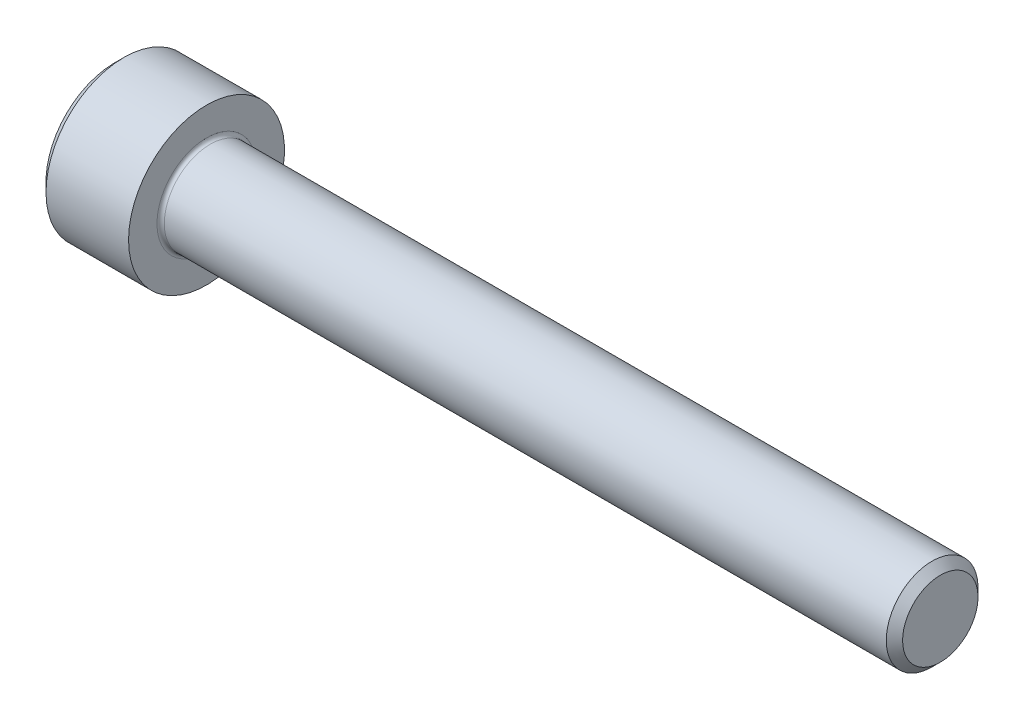
ISO-10303-21;
HEADER;
FILE_DESCRIPTION(('STEP AP214'),'2;1');
FILE_NAME('part.step','',(''),(''),'','','');
FILE_SCHEMA(('AUTOMOTIVE_DESIGN { 1 0 10303 214 1 1 1 1 }'));
ENDSEC;
DATA;
#1=APPLICATION_CONTEXT('core data for automotive mechanical design processes');
#2=APPLICATION_PROTOCOL_DEFINITION('international standard','automotive_design',2000,#1);
#3=PRODUCT_CONTEXT('',#1,'mechanical');
#4=PRODUCT('Part','Part','',(#3));
#5=PRODUCT_RELATED_PRODUCT_CATEGORY('part','',(#4));
#6=PRODUCT_DEFINITION_FORMATION('','',#4);
#7=PRODUCT_DEFINITION_CONTEXT('part definition',#1,'design');
#8=PRODUCT_DEFINITION('design','',#6,#7);
#9=PRODUCT_DEFINITION_SHAPE('','',#8);
#10=(LENGTH_UNIT() NAMED_UNIT(*) SI_UNIT(.MILLI.,.METRE.));
#11=(NAMED_UNIT(*) PLANE_ANGLE_UNIT() SI_UNIT($,.RADIAN.));
#12=(NAMED_UNIT(*) SI_UNIT($,.STERADIAN.) SOLID_ANGLE_UNIT());
#13=UNCERTAINTY_MEASURE_WITH_UNIT(LENGTH_MEASURE(1.E-05),#10,'distance_accuracy_value','');
#14=(GEOMETRIC_REPRESENTATION_CONTEXT(3) GLOBAL_UNCERTAINTY_ASSIGNED_CONTEXT((#13)) GLOBAL_UNIT_ASSIGNED_CONTEXT((#10,
#11,#12)) REPRESENTATION_CONTEXT('',''));
#15=CARTESIAN_POINT('',(0.,0.,0.));
#16=DIRECTION('',(0.,0.,1.));
#17=DIRECTION('',(1.,0.,0.));
#18=AXIS2_PLACEMENT_3D('',#15,#16,#17);
#19=CARTESIAN_POINT('',(2.5,0.,0.));
#20=DIRECTION('',(-1.,0.,0.));
#21=DIRECTION('',(0.,0.,-1.));
#22=AXIS2_PLACEMENT_3D('',#19,#20,#21);
#23=CONICAL_SURFACE('',#22,2.042,1.0471975511966);
#24=DIRECTION('',(-0.5,0.,0.866025403784438));
#25=VECTOR('',#24,1.);
#26=CARTESIAN_POINT('',(2.5,0.,2.042));
#27=LINE('',#26,#25);
#28=CARTESIAN_POINT('',(3.67894924968522,0.,0.));
#29=VERTEX_POINT('',#28);
#30=CARTESIAN_POINT('',(2.5,0.,2.042));
#31=VERTEX_POINT('',#30);
#32=EDGE_CURVE('E11',#29,#31,#27,.T.);
#33=ORIENTED_EDGE('',*,*,#32,.T.);
#34=CARTESIAN_POINT('',(2.5,0.,0.));
#35=DIRECTION('',(1.,0.,0.));
#36=DIRECTION('',(0.,0.,-1.));
#37=AXIS2_PLACEMENT_3D('',#34,#35,#36);
#38=CIRCLE('',#37,2.042);
#39=CARTESIAN_POINT('',(2.5,1.76842387452782,1.021));
#40=VERTEX_POINT('',#39);
#41=EDGE_CURVE('E27',#40,#31,#38,.T.);
#42=ORIENTED_EDGE('',*,*,#41,.F.);
#43=CARTESIAN_POINT('',(2.5,0.,0.));
#44=DIRECTION('',(1.,0.,0.));
#45=DIRECTION('',(0.,0.,-1.));
#46=AXIS2_PLACEMENT_3D('',#43,#44,#45);
#47=CIRCLE('',#46,2.042);
#48=CARTESIAN_POINT('',(2.5,1.76842387452782,-1.021));
#49=VERTEX_POINT('',#48);
#50=EDGE_CURVE('E205',#49,#40,#47,.T.);
#51=ORIENTED_EDGE('',*,*,#50,.F.);
#52=CARTESIAN_POINT('',(2.5,0.,0.));
#53=DIRECTION('',(1.,0.,0.));
#54=DIRECTION('',(0.,0.,-1.));
#55=AXIS2_PLACEMENT_3D('',#52,#53,#54);
#56=CIRCLE('',#55,2.042);
#57=CARTESIAN_POINT('',(2.5,0.,-2.042));
#58=VERTEX_POINT('',#57);
#59=EDGE_CURVE('E196',#58,#49,#56,.T.);
#60=ORIENTED_EDGE('',*,*,#59,.F.);
#61=CARTESIAN_POINT('',(2.5,0.,0.));
#62=DIRECTION('',(1.,0.,0.));
#63=DIRECTION('',(0.,0.,-1.));
#64=AXIS2_PLACEMENT_3D('',#61,#62,#63);
#65=CIRCLE('',#64,2.042);
#66=CARTESIAN_POINT('',(2.5,-1.76842387452782,-1.021));
#67=VERTEX_POINT('',#66);
#68=EDGE_CURVE('E192',#67,#58,#65,.T.);
#69=ORIENTED_EDGE('',*,*,#68,.F.);
#70=CARTESIAN_POINT('',(2.5,0.,0.));
#71=DIRECTION('',(1.,0.,0.));
#72=DIRECTION('',(0.,0.,-1.));
#73=AXIS2_PLACEMENT_3D('',#70,#71,#72);
#74=CIRCLE('',#73,2.042);
#75=CARTESIAN_POINT('',(2.5,-1.76842387452783,1.021));
#76=VERTEX_POINT('',#75);
#77=EDGE_CURVE('E197',#76,#67,#74,.T.);
#78=ORIENTED_EDGE('',*,*,#77,.F.);
#79=CARTESIAN_POINT('',(2.5,0.,0.));
#80=DIRECTION('',(1.,0.,0.));
#81=DIRECTION('',(0.,0.,-1.));
#82=AXIS2_PLACEMENT_3D('',#79,#80,#81);
#83=CIRCLE('',#82,2.042);
#84=EDGE_CURVE('E225',#31,#76,#83,.T.);
#85=ORIENTED_EDGE('',*,*,#84,.F.);
#86=ORIENTED_EDGE('',*,*,#32,.F.);
#87=EDGE_LOOP('',(#33,#42,#51,#60,#69,#78,#85,#86));
#88=FACE_BOUND('',#87,.T.);
#89=ADVANCED_FACE('F17',(#88),#23,.F.);
#90=CARTESIAN_POINT('',(2.5,2.35789849937043,0.));
#91=DIRECTION('',(-1.,0.,0.));
#92=DIRECTION('',(0.,0.,1.));
#93=AXIS2_PLACEMENT_3D('',#90,#91,#92);
#94=PLANE('',#93);
#95=DIRECTION('',(0.,-0.5,0.866025403784439));
#96=VECTOR('',#95,1.);
#97=CARTESIAN_POINT('',(2.5,1.76842387452782,1.021));
#98=LINE('',#97,#96);
#99=CARTESIAN_POINT('',(2.5,1.17894924968521,2.042));
#100=VERTEX_POINT('',#99);
#101=EDGE_CURVE('E221',#40,#100,#98,.T.);
#102=ORIENTED_EDGE('',*,*,#101,.F.);
#103=ORIENTED_EDGE('',*,*,#41,.T.);
#104=DIRECTION('',(0.,-1.,0.));
#105=VECTOR('',#104,1.);
#106=CARTESIAN_POINT('',(2.5,1.17894924968521,2.042));
#107=LINE('',#106,#105);
#108=EDGE_CURVE('E187',#100,#31,#107,.T.);
#109=ORIENTED_EDGE('',*,*,#108,.F.);
#110=EDGE_LOOP('',(#102,#103,#109));
#111=FACE_BOUND('',#110,.T.);
#112=ADVANCED_FACE('F275',(#111),#94,.T.);
#113=CARTESIAN_POINT('',(2.5,2.35789849937043,0.));
#114=DIRECTION('',(-1.,0.,0.));
#115=DIRECTION('',(0.,0.,1.));
#116=AXIS2_PLACEMENT_3D('',#113,#114,#115);
#117=PLANE('',#116);
#118=DIRECTION('',(0.,-0.5,-0.866025403784439));
#119=VECTOR('',#118,1.);
#120=CARTESIAN_POINT('',(2.5,2.35789849937043,0.));
#121=LINE('',#120,#119);
#122=CARTESIAN_POINT('',(2.5,2.35789849937043,0.));
#123=VERTEX_POINT('',#122);
#124=EDGE_CURVE('E250',#123,#49,#121,.T.);
#125=ORIENTED_EDGE('',*,*,#124,.T.);
#126=ORIENTED_EDGE('',*,*,#50,.T.);
#127=DIRECTION('',(0.,-0.5,0.866025403784438));
#128=VECTOR('',#127,1.);
#129=CARTESIAN_POINT('',(2.5,2.35789849937043,0.));
#130=LINE('',#129,#128);
#131=EDGE_CURVE('E226',#123,#40,#130,.T.);
#132=ORIENTED_EDGE('',*,*,#131,.F.);
#133=EDGE_LOOP('',(#125,#126,#132));
#134=FACE_BOUND('',#133,.T.);
#135=ADVANCED_FACE('F379',(#134),#117,.T.);
#136=CARTESIAN_POINT('',(2.5,2.35789849937043,0.));
#137=DIRECTION('',(-1.,0.,0.));
#138=DIRECTION('',(0.,0.,1.));
#139=AXIS2_PLACEMENT_3D('',#136,#137,#138);
#140=PLANE('',#139);
#141=DIRECTION('',(0.,1.,0.));
#142=VECTOR('',#141,1.);
#143=CARTESIAN_POINT('',(2.5,0.,-2.042));
#144=LINE('',#143,#142);
#145=CARTESIAN_POINT('',(2.5,1.17894924968521,-2.042));
#146=VERTEX_POINT('',#145);
#147=EDGE_CURVE('E120',#58,#146,#144,.T.);
#148=ORIENTED_EDGE('',*,*,#147,.F.);
#149=ORIENTED_EDGE('',*,*,#59,.T.);
#150=DIRECTION('',(0.,-0.5,-0.866025403784439));
#151=VECTOR('',#150,1.);
#152=CARTESIAN_POINT('',(2.5,1.76842387452782,-1.021));
#153=LINE('',#152,#151);
#154=EDGE_CURVE('E126',#49,#146,#153,.T.);
#155=ORIENTED_EDGE('',*,*,#154,.T.);
#156=EDGE_LOOP('',(#148,#149,#155));
#157=FACE_BOUND('',#156,.T.);
#158=ADVANCED_FACE('F394',(#157),#140,.T.);
#159=CARTESIAN_POINT('',(2.5,2.35789849937043,0.));
#160=DIRECTION('',(-1.,0.,0.));
#161=DIRECTION('',(0.,0.,1.));
#162=AXIS2_PLACEMENT_3D('',#159,#160,#161);
#163=PLANE('',#162);
#164=DIRECTION('',(0.,-0.5,0.866025403784438));
#165=VECTOR('',#164,1.);
#166=CARTESIAN_POINT('',(2.5,-1.17894924968522,-2.042));
#167=LINE('',#166,#165);
#168=CARTESIAN_POINT('',(2.5,-1.17894924968522,-2.042));
#169=VERTEX_POINT('',#168);
#170=EDGE_CURVE('E210',#169,#67,#167,.T.);
#171=ORIENTED_EDGE('',*,*,#170,.T.);
#172=ORIENTED_EDGE('',*,*,#68,.T.);
#173=DIRECTION('',(0.,1.,0.));
#174=VECTOR('',#173,1.);
#175=CARTESIAN_POINT('',(2.5,-1.17894924968522,-2.042));
#176=LINE('',#175,#174);
#177=EDGE_CURVE('E220',#169,#58,#176,.T.);
#178=ORIENTED_EDGE('',*,*,#177,.F.);
#179=EDGE_LOOP('',(#171,#172,#178));
#180=FACE_BOUND('',#179,.T.);
#181=ADVANCED_FACE('F324',(#180),#163,.T.);
#182=CARTESIAN_POINT('',(2.5,2.35789849937043,0.));
#183=DIRECTION('',(-1.,0.,0.));
#184=DIRECTION('',(0.,0.,1.));
#185=AXIS2_PLACEMENT_3D('',#182,#183,#184);
#186=PLANE('',#185);
#187=DIRECTION('',(0.,0.5,0.866025403784439));
#188=VECTOR('',#187,1.);
#189=CARTESIAN_POINT('',(2.5,-2.35789849937043,0.));
#190=LINE('',#189,#188);
#191=CARTESIAN_POINT('',(2.5,-2.35789849937043,0.));
#192=VERTEX_POINT('',#191);
#193=EDGE_CURVE('E178',#192,#76,#190,.T.);
#194=ORIENTED_EDGE('',*,*,#193,.T.);
#195=ORIENTED_EDGE('',*,*,#77,.T.);
#196=DIRECTION('',(0.,-0.5,0.866025403784439));
#197=VECTOR('',#196,1.);
#198=CARTESIAN_POINT('',(2.5,-1.76842387452783,-1.021));
#199=LINE('',#198,#197);
#200=EDGE_CURVE('E259',#67,#192,#199,.T.);
#201=ORIENTED_EDGE('',*,*,#200,.T.);
#202=EDGE_LOOP('',(#194,#195,#201));
#203=FACE_BOUND('',#202,.T.);
#204=ADVANCED_FACE('F328',(#203),#186,.T.);
#205=CARTESIAN_POINT('',(2.5,2.35789849937043,0.));
#206=DIRECTION('',(-1.,0.,0.));
#207=DIRECTION('',(0.,0.,1.));
#208=AXIS2_PLACEMENT_3D('',#205,#206,#207);
#209=PLANE('',#208);
#210=DIRECTION('',(0.,-1.,0.));
#211=VECTOR('',#210,1.);
#212=CARTESIAN_POINT('',(2.5,0.,2.042));
#213=LINE('',#212,#211);
#214=CARTESIAN_POINT('',(2.5,-1.17894924968522,2.042));
#215=VERTEX_POINT('',#214);
#216=EDGE_CURVE('E191',#31,#215,#213,.T.);
#217=ORIENTED_EDGE('',*,*,#216,.F.);
#218=ORIENTED_EDGE('',*,*,#84,.T.);
#219=DIRECTION('',(0.,0.5,0.866025403784439));
#220=VECTOR('',#219,1.);
#221=CARTESIAN_POINT('',(2.5,-1.76842387452783,1.021));
#222=LINE('',#221,#220);
#223=EDGE_CURVE('E183',#76,#215,#222,.T.);
#224=ORIENTED_EDGE('',*,*,#223,.T.);
#225=EDGE_LOOP('',(#217,#218,#224));
#226=FACE_BOUND('',#225,.T.);
#227=ADVANCED_FACE('F282',(#226),#209,.T.);
#228=CARTESIAN_POINT('',(2.5,2.35789849937043,0.));
#229=DIRECTION('',(0.,-0.866025403784439,-0.5));
#230=DIRECTION('',(0.,0.5,-0.866025403784439));
#231=AXIS2_PLACEMENT_3D('',#228,#229,#230);
#232=PLANE('',#231);
#233=DIRECTION('',(0.,-0.5,0.866025403784438));
#234=VECTOR('',#233,1.);
#235=CARTESIAN_POINT('',(0.,2.35789849937043,0.));
#236=LINE('',#235,#234);
#237=CARTESIAN_POINT('',(0.,2.35789849937043,0.));
#238=VERTEX_POINT('',#237);
#239=CARTESIAN_POINT('',(0.,1.17894924968521,2.042));
#240=VERTEX_POINT('',#239);
#241=EDGE_CURVE('E147',#238,#240,#236,.T.);
#242=ORIENTED_EDGE('',*,*,#241,.F.);
#243=DIRECTION('',(-1.,0.,0.));
#244=VECTOR('',#243,1.);
#245=CARTESIAN_POINT('',(2.5,2.35789849937043,0.));
#246=LINE('',#245,#244);
#247=EDGE_CURVE('E144',#123,#238,#246,.T.);
#248=ORIENTED_EDGE('',*,*,#247,.F.);
#249=ORIENTED_EDGE('',*,*,#131,.T.);
#250=ORIENTED_EDGE('',*,*,#101,.T.);
#251=DIRECTION('',(-1.,0.,0.));
#252=VECTOR('',#251,1.);
#253=CARTESIAN_POINT('',(2.5,1.17894924968521,2.042));
#254=LINE('',#253,#252);
#255=EDGE_CURVE('E182',#100,#240,#254,.T.);
#256=ORIENTED_EDGE('',*,*,#255,.T.);
#257=EDGE_LOOP('',(#242,#248,#249,#250,#256));
#258=FACE_BOUND('',#257,.T.);
#259=ADVANCED_FACE('F290',(#258),#232,.T.);
#260=CARTESIAN_POINT('',(2.5,1.17894924968521,2.042));
#261=DIRECTION('',(0.,0.,-1.));
#262=DIRECTION('',(-1.,0.,0.));
#263=AXIS2_PLACEMENT_3D('',#260,#261,#262);
#264=PLANE('',#263);
#265=DIRECTION('',(0.,-1.,0.));
#266=VECTOR('',#265,1.);
#267=CARTESIAN_POINT('',(0.,1.17894924968521,2.042));
#268=LINE('',#267,#266);
#269=CARTESIAN_POINT('',(0.,-1.17894924968522,2.042));
#270=VERTEX_POINT('',#269);
#271=EDGE_CURVE('E155',#240,#270,#268,.T.);
#272=ORIENTED_EDGE('',*,*,#271,.F.);
#273=ORIENTED_EDGE('',*,*,#255,.F.);
#274=ORIENTED_EDGE('',*,*,#108,.T.);
#275=ORIENTED_EDGE('',*,*,#216,.T.);
#276=DIRECTION('',(-1.,0.,0.));
#277=VECTOR('',#276,1.);
#278=CARTESIAN_POINT('',(2.5,-1.17894924968522,2.042));
#279=LINE('',#278,#277);
#280=EDGE_CURVE('E206',#215,#270,#279,.T.);
#281=ORIENTED_EDGE('',*,*,#280,.T.);
#282=EDGE_LOOP('',(#272,#273,#274,#275,#281));
#283=FACE_BOUND('',#282,.T.);
#284=ADVANCED_FACE('F287',(#283),#264,.T.);
#285=CARTESIAN_POINT('',(2.5,-2.35789849937043,0.));
#286=DIRECTION('',(0.,-0.866025403784439,0.5));
#287=DIRECTION('',(-1.,0.,0.));
#288=AXIS2_PLACEMENT_3D('',#285,#286,#287);
#289=PLANE('',#288);
#290=DIRECTION('',(0.,0.5,0.866025403784439));
#291=VECTOR('',#290,1.);
#292=CARTESIAN_POINT('',(0.,-2.35789849937043,0.));
#293=LINE('',#292,#291);
#294=CARTESIAN_POINT('',(0.,-2.35789849937043,0.));
#295=VERTEX_POINT('',#294);
#296=EDGE_CURVE('E229',#295,#270,#293,.T.);
#297=ORIENTED_EDGE('',*,*,#296,.T.);
#298=ORIENTED_EDGE('',*,*,#280,.F.);
#299=ORIENTED_EDGE('',*,*,#223,.F.);
#300=ORIENTED_EDGE('',*,*,#193,.F.);
#301=DIRECTION('',(-1.,0.,0.));
#302=VECTOR('',#301,1.);
#303=CARTESIAN_POINT('',(2.5,-2.35789849937043,0.));
#304=LINE('',#303,#302);
#305=EDGE_CURVE('E219',#192,#295,#304,.T.);
#306=ORIENTED_EDGE('',*,*,#305,.T.);
#307=EDGE_LOOP('',(#297,#298,#299,#300,#306));
#308=FACE_BOUND('',#307,.T.);
#309=ADVANCED_FACE('F398',(#308),#289,.F.);
#310=CARTESIAN_POINT('',(2.5,-1.17894924968522,-2.042));
#311=DIRECTION('',(0.,-0.866025403784439,-0.5));
#312=DIRECTION('',(0.,0.5,-0.866025403784439));
#313=AXIS2_PLACEMENT_3D('',#310,#311,#312);
#314=PLANE('',#313);
#315=DIRECTION('',(0.,-0.5,0.866025403784438));
#316=VECTOR('',#315,1.);
#317=CARTESIAN_POINT('',(0.,-1.17894924968522,-2.042));
#318=LINE('',#317,#316);
#319=CARTESIAN_POINT('',(0.,-1.17894924968522,-2.042));
#320=VERTEX_POINT('',#319);
#321=EDGE_CURVE('E137',#320,#295,#318,.T.);
#322=ORIENTED_EDGE('',*,*,#321,.T.);
#323=ORIENTED_EDGE('',*,*,#305,.F.);
#324=ORIENTED_EDGE('',*,*,#200,.F.);
#325=ORIENTED_EDGE('',*,*,#170,.F.);
#326=DIRECTION('',(-1.,0.,0.));
#327=VECTOR('',#326,1.);
#328=CARTESIAN_POINT('',(2.5,-1.17894924968522,-2.042));
#329=LINE('',#328,#327);
#330=EDGE_CURVE('E244',#169,#320,#329,.T.);
#331=ORIENTED_EDGE('',*,*,#330,.T.);
#332=EDGE_LOOP('',(#322,#323,#324,#325,#331));
#333=FACE_BOUND('',#332,.T.);
#334=ADVANCED_FACE('F19',(#333),#314,.F.);
#335=CARTESIAN_POINT('',(2.5,-1.17894924968522,-2.042));
#336=DIRECTION('',(0.,0.,1.));
#337=DIRECTION('',(0.,-1.,0.));
#338=AXIS2_PLACEMENT_3D('',#335,#336,#337);
#339=PLANE('',#338);
#340=DIRECTION('',(0.,1.,0.));
#341=VECTOR('',#340,1.);
#342=CARTESIAN_POINT('',(0.,-1.17894924968522,-2.042));
#343=LINE('',#342,#341);
#344=CARTESIAN_POINT('',(0.,1.17894924968521,-2.042));
#345=VERTEX_POINT('',#344);
#346=EDGE_CURVE('E116',#320,#345,#343,.T.);
#347=ORIENTED_EDGE('',*,*,#346,.F.);
#348=ORIENTED_EDGE('',*,*,#330,.F.);
#349=ORIENTED_EDGE('',*,*,#177,.T.);
#350=ORIENTED_EDGE('',*,*,#147,.T.);
#351=DIRECTION('',(-1.,0.,0.));
#352=VECTOR('',#351,1.);
#353=CARTESIAN_POINT('',(2.5,1.17894924968521,-2.042));
#354=LINE('',#353,#352);
#355=EDGE_CURVE('E112',#146,#345,#354,.T.);
#356=ORIENTED_EDGE('',*,*,#355,.T.);
#357=EDGE_LOOP('',(#347,#348,#349,#350,#356));
#358=FACE_BOUND('',#357,.T.);
#359=ADVANCED_FACE('F114',(#358),#339,.T.);
#360=CARTESIAN_POINT('',(2.5,2.35789849937043,0.));
#361=DIRECTION('',(0.,0.866025403784439,-0.5));
#362=DIRECTION('',(-1.,0.,0.));
#363=AXIS2_PLACEMENT_3D('',#360,#361,#362);
#364=PLANE('',#363);
#365=DIRECTION('',(0.,-0.5,-0.866025403784439));
#366=VECTOR('',#365,1.);
#367=CARTESIAN_POINT('',(0.,2.35789849937043,0.));
#368=LINE('',#367,#366);
#369=EDGE_CURVE('E134',#238,#345,#368,.T.);
#370=ORIENTED_EDGE('',*,*,#369,.T.);
#371=ORIENTED_EDGE('',*,*,#355,.F.);
#372=ORIENTED_EDGE('',*,*,#154,.F.);
#373=ORIENTED_EDGE('',*,*,#124,.F.);
#374=ORIENTED_EDGE('',*,*,#247,.T.);
#375=EDGE_LOOP('',(#370,#371,#372,#373,#374));
#376=FACE_BOUND('',#375,.T.);
#377=ADVANCED_FACE('F141',(#376),#364,.F.);
#378=CARTESIAN_POINT('',(5.2,0.,0.));
#379=DIRECTION('',(1.,0.,0.));
#380=DIRECTION('',(0.,0.,1.));
#381=AXIS2_PLACEMENT_3D('',#378,#379,#380);
#382=TOROIDAL_SURFACE('',#381,2.7,0.2);
#383=CARTESIAN_POINT('',(5.2,0.,0.));
#384=DIRECTION('',(-1.,0.,0.));
#385=DIRECTION('',(0.,0.,1.));
#386=AXIS2_PLACEMENT_3D('',#383,#384,#385);
#387=CIRCLE('',#386,2.5);
#388=CARTESIAN_POINT('',(5.2,0.,2.5));
#389=VERTEX_POINT('',#388);
#390=CARTESIAN_POINT('',(5.2,0.,-2.5));
#391=VERTEX_POINT('',#390);
#392=EDGE_CURVE('E167',#389,#391,#387,.T.);
#393=ORIENTED_EDGE('',*,*,#392,.T.);
#394=CARTESIAN_POINT('',(5.2,0.,-2.7));
#395=DIRECTION('',(0.,-1.,0.));
#396=DIRECTION('',(0.,0.,-1.));
#397=AXIS2_PLACEMENT_3D('',#394,#395,#396);
#398=CIRCLE('',#397,0.2);
#399=CARTESIAN_POINT('',(5.,0.,-2.7));
#400=VERTEX_POINT('',#399);
#401=EDGE_CURVE('E127',#391,#400,#398,.T.);
#402=ORIENTED_EDGE('',*,*,#401,.T.);
#403=CARTESIAN_POINT('',(5.,0.,0.));
#404=DIRECTION('',(1.,0.,0.));
#405=DIRECTION('',(0.,0.,1.));
#406=AXIS2_PLACEMENT_3D('',#403,#404,#405);
#407=CIRCLE('',#406,2.7);
#408=EDGE_CURVE('E172',#400,#400,#407,.T.);
#409=ORIENTED_EDGE('',*,*,#408,.T.);
#410=ORIENTED_EDGE('',*,*,#401,.F.);
#411=CARTESIAN_POINT('',(5.2,0.,0.));
#412=DIRECTION('',(-1.,0.,0.));
#413=DIRECTION('',(0.,0.,1.));
#414=AXIS2_PLACEMENT_3D('',#411,#412,#413);
#415=CIRCLE('',#414,2.5);
#416=EDGE_CURVE('E173',#391,#389,#415,.T.);
#417=ORIENTED_EDGE('',*,*,#416,.T.);
#418=EDGE_LOOP('',(#393,#402,#409,#410,#417));
#419=FACE_BOUND('',#418,.T.);
#420=ADVANCED_FACE('F386',(#419),#382,.F.);
#421=CARTESIAN_POINT('',(45.,2.055,0.));
#422=DIRECTION('',(-1.,0.,0.));
#423=DIRECTION('',(0.,0.,1.));
#424=AXIS2_PLACEMENT_3D('',#421,#422,#423);
#425=PLANE('',#424);
#426=CARTESIAN_POINT('',(45.,0.,0.));
#427=DIRECTION('',(1.,0.,0.));
#428=DIRECTION('',(0.,0.,-1.));
#429=AXIS2_PLACEMENT_3D('',#426,#427,#428);
#430=CIRCLE('',#429,2.055);
#431=CARTESIAN_POINT('',(45.,0.,2.055));
#432=VERTEX_POINT('',#431);
#433=EDGE_CURVE('E233',#432,#432,#430,.T.);
#434=ORIENTED_EDGE('',*,*,#433,.T.);
#435=EDGE_LOOP('',(#434));
#436=FACE_BOUND('',#435,.T.);
#437=ADVANCED_FACE('F389',(#436),#425,.F.);
#438=CARTESIAN_POINT('',(45.,0.,0.));
#439=DIRECTION('',(-1.,0.,0.));
#440=DIRECTION('',(0.,0.,-1.));
#441=AXIS2_PLACEMENT_3D('',#438,#439,#440);
#442=CONICAL_SURFACE('',#441,2.055,0.785398163397479);
#443=CARTESIAN_POINT('',(44.555,0.,0.));
#444=DIRECTION('',(1.,0.,0.));
#445=DIRECTION('',(0.,0.,-1.));
#446=AXIS2_PLACEMENT_3D('',#443,#444,#445);
#447=CIRCLE('',#446,2.5);
#448=CARTESIAN_POINT('',(44.555,0.,2.5));
#449=VERTEX_POINT('',#448);
#450=EDGE_CURVE('E177',#449,#449,#447,.T.);
#451=ORIENTED_EDGE('',*,*,#450,.T.);
#452=DIRECTION('',(0.707106781186526,0.,-0.707106781186569));
#453=VECTOR('',#452,1.);
#454=CARTESIAN_POINT('',(45.,0.,2.055));
#455=LINE('',#454,#453);
#456=EDGE_CURVE('E176',#449,#432,#455,.T.);
#457=ORIENTED_EDGE('',*,*,#456,.T.);
#458=ORIENTED_EDGE('',*,*,#433,.F.);
#459=ORIENTED_EDGE('',*,*,#456,.F.);
#460=EDGE_LOOP('',(#451,#457,#458,#459));
#461=FACE_BOUND('',#460,.T.);
#462=ADVANCED_FACE('F417',(#461),#442,.T.);
#463=CARTESIAN_POINT('',(-31.75,0.,0.));
#464=DIRECTION('',(1.,0.,0.));
#465=DIRECTION('',(0.,0.,-1.));
#466=AXIS2_PLACEMENT_3D('',#463,#464,#465);
#467=CYLINDRICAL_SURFACE('',#466,2.5);
#468=ORIENTED_EDGE('',*,*,#392,.F.);
#469=DIRECTION('',(1.,0.,0.));
#470=VECTOR('',#469,1.);
#471=CARTESIAN_POINT('',(-31.75,0.,2.5));
#472=LINE('',#471,#470);
#473=EDGE_CURVE('E171',#389,#449,#472,.T.);
#474=ORIENTED_EDGE('',*,*,#473,.T.);
#475=ORIENTED_EDGE('',*,*,#450,.F.);
#476=ORIENTED_EDGE('',*,*,#473,.F.);
#477=ORIENTED_EDGE('',*,*,#416,.F.);
#478=EDGE_LOOP('',(#468,#474,#475,#476,#477));
#479=FACE_BOUND('',#478,.T.);
#480=ADVANCED_FACE('F412',(#479),#467,.T.);
#481=CARTESIAN_POINT('',(5.,4.25,0.));
#482=DIRECTION('',(-1.,0.,0.));
#483=DIRECTION('',(0.,0.,1.));
#484=AXIS2_PLACEMENT_3D('',#481,#482,#483);
#485=PLANE('',#484);
#486=ORIENTED_EDGE('',*,*,#408,.F.);
#487=EDGE_LOOP('',(#486));
#488=FACE_BOUND('',#487,.T.);
#489=CARTESIAN_POINT('',(5.,0.,0.));
#490=DIRECTION('',(1.,0.,0.));
#491=DIRECTION('',(0.,0.,-1.));
#492=AXIS2_PLACEMENT_3D('',#489,#490,#491);
#493=CIRCLE('',#492,4.25);
#494=CARTESIAN_POINT('',(5.,0.,4.25));
#495=VERTEX_POINT('',#494);
#496=EDGE_CURVE('E165',#495,#495,#493,.T.);
#497=ORIENTED_EDGE('',*,*,#496,.T.);
#498=EDGE_LOOP('',(#497));
#499=FACE_BOUND('',#498,.T.);
#500=ADVANCED_FACE('F357',(#488,#499),#485,.F.);
#501=CARTESIAN_POINT('',(-31.75,0.,0.));
#502=DIRECTION('',(1.,0.,0.));
#503=DIRECTION('',(0.,0.,-1.));
#504=AXIS2_PLACEMENT_3D('',#501,#502,#503);
#505=CYLINDRICAL_SURFACE('',#504,4.25);
#506=CARTESIAN_POINT('',(0.5,0.,0.));
#507=DIRECTION('',(1.,0.,0.));
#508=DIRECTION('',(0.,0.,-1.));
#509=AXIS2_PLACEMENT_3D('',#506,#507,#508);
#510=CIRCLE('',#509,4.25);
#511=CARTESIAN_POINT('',(0.5,0.,-4.25));
#512=VERTEX_POINT('',#511);
#513=CARTESIAN_POINT('',(0.5,0.,4.25));
#514=VERTEX_POINT('',#513);
#515=EDGE_CURVE('E139',#512,#514,#510,.T.);
#516=ORIENTED_EDGE('',*,*,#515,.T.);
#517=DIRECTION('',(1.,0.,0.));
#518=VECTOR('',#517,1.);
#519=CARTESIAN_POINT('',(-31.75,0.,4.25));
#520=LINE('',#519,#518);
#521=EDGE_CURVE('E161',#514,#495,#520,.T.);
#522=ORIENTED_EDGE('',*,*,#521,.T.);
#523=ORIENTED_EDGE('',*,*,#496,.F.);
#524=ORIENTED_EDGE('',*,*,#521,.F.);
#525=CARTESIAN_POINT('',(0.5,0.,0.));
#526=DIRECTION('',(1.,0.,0.));
#527=DIRECTION('',(0.,0.,-1.));
#528=AXIS2_PLACEMENT_3D('',#525,#526,#527);
#529=CIRCLE('',#528,4.25);
#530=EDGE_CURVE('E166',#514,#512,#529,.T.);
#531=ORIENTED_EDGE('',*,*,#530,.T.);
#532=EDGE_LOOP('',(#516,#522,#523,#524,#531));
#533=FACE_BOUND('',#532,.T.);
#534=ADVANCED_FACE('F359',(#533),#505,.T.);
#535=CARTESIAN_POINT('',(0.,0.,0.));
#536=DIRECTION('',(1.,0.,0.));
#537=DIRECTION('',(0.,0.,1.));
#538=AXIS2_PLACEMENT_3D('',#535,#536,#537);
#539=CONICAL_SURFACE('',#538,3.75,0.785398163397446);
#540=ORIENTED_EDGE('',*,*,#515,.F.);
#541=DIRECTION('',(-0.707106781186549,0.,0.707106781186546));
#542=VECTOR('',#541,1.);
#543=CARTESIAN_POINT('',(0.,0.,-3.75));
#544=LINE('',#543,#542);
#545=CARTESIAN_POINT('',(0.,0.,-3.75));
#546=VERTEX_POINT('',#545);
#547=EDGE_CURVE('E198',#512,#546,#544,.T.);
#548=ORIENTED_EDGE('',*,*,#547,.T.);
#549=CARTESIAN_POINT('',(0.,0.,0.));
#550=DIRECTION('',(1.,0.,0.));
#551=DIRECTION('',(0.,0.,-1.));
#552=AXIS2_PLACEMENT_3D('',#549,#550,#551);
#553=CIRCLE('',#552,3.75);
#554=EDGE_CURVE('E148',#546,#546,#553,.T.);
#555=ORIENTED_EDGE('',*,*,#554,.T.);
#556=ORIENTED_EDGE('',*,*,#547,.F.);
#557=ORIENTED_EDGE('',*,*,#530,.F.);
#558=EDGE_LOOP('',(#540,#548,#555,#556,#557));
#559=FACE_BOUND('',#558,.T.);
#560=ADVANCED_FACE('F364',(#559),#539,.T.);
#561=CARTESIAN_POINT('',(0.,0.,0.));
#562=DIRECTION('',(1.,0.,0.));
#563=DIRECTION('',(0.,1.,0.));
#564=AXIS2_PLACEMENT_3D('',#561,#562,#563);
#565=PLANE('',#564);
#566=ORIENTED_EDGE('',*,*,#369,.F.);
#567=ORIENTED_EDGE('',*,*,#241,.T.);
#568=ORIENTED_EDGE('',*,*,#271,.T.);
#569=ORIENTED_EDGE('',*,*,#296,.F.);
#570=ORIENTED_EDGE('',*,*,#321,.F.);
#571=ORIENTED_EDGE('',*,*,#346,.T.);
#572=EDGE_LOOP('',(#566,#567,#568,#569,#570,#571));
#573=FACE_BOUND('',#572,.T.);
#574=ORIENTED_EDGE('',*,*,#554,.F.);
#575=EDGE_LOOP('',(#574));
#576=FACE_BOUND('',#575,.T.);
#577=ADVANCED_FACE('F131',(#573,#576),#565,.F.);
#578=CLOSED_SHELL('',(#89,#112,#135,#158,#181,#204,#227,#259,#284,#309,#334,#359,#377,#420,#437,
#462,#480,#500,#534,#560,#577));
#579=MANIFOLD_SOLID_BREP('B1',#578);
#580=ADVANCED_BREP_SHAPE_REPRESENTATION('',(#18,#579),#14);
#581=SHAPE_DEFINITION_REPRESENTATION(#9,#580);
ENDSEC;
END-ISO-10303-21;
